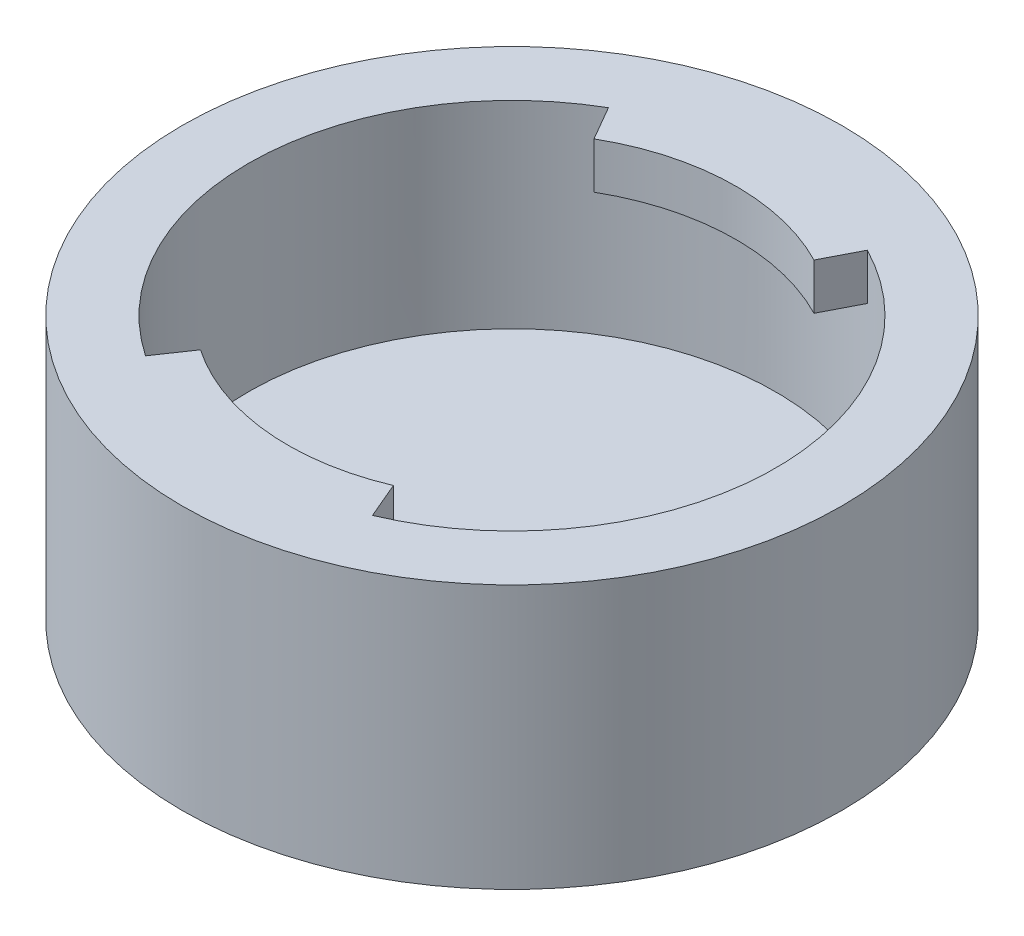
ISO-10303-21;
HEADER;
FILE_DESCRIPTION(('STEP AP214'),'2;1');
FILE_NAME('part.step','',(''),(''),'','','');
FILE_SCHEMA(('AUTOMOTIVE_DESIGN { 1 0 10303 214 1 1 1 1 }'));
ENDSEC;
DATA;
#1=APPLICATION_CONTEXT('core data for automotive mechanical design processes');
#2=APPLICATION_PROTOCOL_DEFINITION('international standard','automotive_design',2000,#1);
#3=PRODUCT_CONTEXT('',#1,'mechanical');
#4=PRODUCT('Part','Part','',(#3));
#5=PRODUCT_RELATED_PRODUCT_CATEGORY('part','',(#4));
#6=PRODUCT_DEFINITION_FORMATION('','',#4);
#7=PRODUCT_DEFINITION_CONTEXT('part definition',#1,'design');
#8=PRODUCT_DEFINITION('design','',#6,#7);
#9=PRODUCT_DEFINITION_SHAPE('','',#8);
#10=(LENGTH_UNIT() NAMED_UNIT(*) SI_UNIT(.MILLI.,.METRE.));
#11=(NAMED_UNIT(*) PLANE_ANGLE_UNIT() SI_UNIT($,.RADIAN.));
#12=(NAMED_UNIT(*) SI_UNIT($,.STERADIAN.) SOLID_ANGLE_UNIT());
#13=UNCERTAINTY_MEASURE_WITH_UNIT(LENGTH_MEASURE(1.E-05),#10,'distance_accuracy_value','');
#14=(GEOMETRIC_REPRESENTATION_CONTEXT(3) GLOBAL_UNCERTAINTY_ASSIGNED_CONTEXT((#13)) GLOBAL_UNIT_ASSIGNED_CONTEXT((#10,
#11,#12)) REPRESENTATION_CONTEXT('',''));
#15=CARTESIAN_POINT('',(0.,0.,0.));
#16=DIRECTION('',(0.,0.,1.));
#17=DIRECTION('',(1.,0.,0.));
#18=AXIS2_PLACEMENT_3D('',#15,#16,#17);
#19=CARTESIAN_POINT('',(0.,1.27,0.));
#20=DIRECTION('',(0.,-1.,0.));
#21=DIRECTION('',(0.,0.,-1.));
#22=AXIS2_PLACEMENT_3D('',#19,#20,#21);
#23=CYLINDRICAL_SURFACE('',#22,6.35);
#24=CARTESIAN_POINT('',(0.,0.,0.));
#25=DIRECTION('',(0.,1.,0.));
#26=DIRECTION('',(0.,0.,1.));
#27=AXIS2_PLACEMENT_3D('',#24,#25,#26);
#28=CIRCLE('',#27,6.35);
#29=CARTESIAN_POINT('',(0.,0.,6.35));
#30=VERTEX_POINT('',#29);
#31=EDGE_CURVE('E90',#30,#30,#28,.T.);
#32=ORIENTED_EDGE('',*,*,#31,.T.);
#33=EDGE_LOOP('',(#32));
#34=FACE_BOUND('',#33,.T.);
#35=CARTESIAN_POINT('',(0.,5.08,0.));
#36=DIRECTION('',(0.,1.,0.));
#37=DIRECTION('',(0.,0.,1.));
#38=AXIS2_PLACEMENT_3D('',#35,#36,#37);
#39=CIRCLE('',#38,6.35);
#40=CARTESIAN_POINT('',(0.,5.08,6.35));
#41=VERTEX_POINT('',#40);
#42=EDGE_CURVE('E232',#41,#41,#39,.T.);
#43=ORIENTED_EDGE('',*,*,#42,.F.);
#44=EDGE_LOOP('',(#43));
#45=FACE_BOUND('',#44,.T.);
#46=ADVANCED_FACE('F83',(#34,#45),#23,.T.);
#47=CARTESIAN_POINT('',(0.,0.,0.));
#48=DIRECTION('',(0.,1.,0.));
#49=DIRECTION('',(0.,0.,1.));
#50=AXIS2_PLACEMENT_3D('',#47,#48,#49);
#51=PLANE('',#50);
#52=ORIENTED_EDGE('',*,*,#31,.F.);
#53=EDGE_LOOP('',(#52));
#54=FACE_BOUND('',#53,.T.);
#55=ADVANCED_FACE('F239',(#54),#51,.F.);
#56=CARTESIAN_POINT('',(0.,5.08,0.));
#57=DIRECTION('',(0.,1.,0.));
#58=DIRECTION('',(0.,0.,1.));
#59=AXIS2_PLACEMENT_3D('',#56,#57,#58);
#60=PLANE('',#59);
#61=ORIENTED_EDGE('',*,*,#42,.T.);
#62=EDGE_LOOP('',(#61));
#63=FACE_BOUND('',#62,.T.);
#64=CARTESIAN_POINT('',(0.,5.08,0.));
#65=DIRECTION('',(0.,1.,0.));
#66=DIRECTION('',(0.,0.,1.));
#67=AXIS2_PLACEMENT_3D('',#64,#65,#66);
#68=CIRCLE('',#67,5.08);
#69=CARTESIAN_POINT('',(1.98775729537348,5.08,4.67495678425903));
#70=VERTEX_POINT('',#69);
#71=CARTESIAN_POINT('',(2.32841772382184,5.08,-4.51496078647338));
#72=VERTEX_POINT('',#71);
#73=EDGE_CURVE('E230',#70,#72,#68,.T.);
#74=ORIENTED_EDGE('',*,*,#73,.F.);
#75=DIRECTION('',(0.391290806175882,0.,0.920267083515557));
#76=VECTOR('',#75,1.);
#77=CARTESIAN_POINT('',(1.98775729537348,5.08,4.67495678425903));
#78=LINE('',#77,#76);
#79=CARTESIAN_POINT('',(1.68959370106745,5.08,3.97371326662018));
#80=VERTEX_POINT('',#79);
#81=EDGE_CURVE('E202',#80,#70,#78,.T.);
#82=ORIENTED_EDGE('',*,*,#81,.F.);
#83=CARTESIAN_POINT('',(0.,5.08,0.));
#84=DIRECTION('',(0.,-1.,0.));
#85=DIRECTION('',(0.,0.,-1.));
#86=AXIS2_PLACEMENT_3D('',#83,#84,#85);
#87=CIRCLE('',#86,4.318);
#88=CARTESIAN_POINT('',(-2.43087304314005,5.08,3.56875051637615));
#89=VERTEX_POINT('',#88);
#90=EDGE_CURVE('E209',#89,#80,#87,.F.);
#91=ORIENTED_EDGE('',*,*,#90,.F.);
#92=DIRECTION('',(-0.562962724210295,0.,0.826482287257097));
#93=VECTOR('',#92,1.);
#94=CARTESIAN_POINT('',(-2.8598506389883,5.08,4.19853001926606));
#95=LINE('',#94,#93);
#96=CARTESIAN_POINT('',(-2.8598506389883,5.08,4.19853001926606));
#97=VERTEX_POINT('',#96);
#98=EDGE_CURVE('E226',#89,#97,#95,.T.);
#99=ORIENTED_EDGE('',*,*,#98,.T.);
#100=CARTESIAN_POINT('',(-2.54115903415761,5.08,-4.39873967894432));
#101=VERTEX_POINT('',#100);
#102=EDGE_CURVE('E153',#101,#97,#68,.T.);
#103=ORIENTED_EDGE('',*,*,#102,.F.);
#104=DIRECTION('',(0.500228156330238,0.,0.865893637587464));
#105=VECTOR('',#104,1.);
#106=CARTESIAN_POINT('',(-2.54115903415761,5.08,-4.39873967894432));
#107=LINE('',#106,#105);
#108=CARTESIAN_POINT('',(-2.15998517903397,5.08,-3.73892872710267));
#109=VERTEX_POINT('',#108);
#110=EDGE_CURVE('E146',#101,#109,#107,.T.);
#111=ORIENTED_EDGE('',*,*,#110,.T.);
#112=CARTESIAN_POINT('',(0.,5.08,0.));
#113=DIRECTION('',(0.,-1.,0.));
#114=DIRECTION('',(0.,0.,-1.));
#115=AXIS2_PLACEMENT_3D('',#112,#113,#114);
#116=CIRCLE('',#115,4.318);
#117=CARTESIAN_POINT('',(1.97915506524856,5.08,-3.83771666850237));
#118=VERTEX_POINT('',#117);
#119=EDGE_CURVE('E151',#118,#109,#116,.F.);
#120=ORIENTED_EDGE('',*,*,#119,.F.);
#121=DIRECTION('',(-0.45834994563422,0.,0.888771808360902));
#122=VECTOR('',#121,1.);
#123=CARTESIAN_POINT('',(2.32841772382184,5.08,-4.51496078647338));
#124=LINE('',#123,#122);
#125=EDGE_CURVE('E155',#72,#118,#124,.T.);
#126=ORIENTED_EDGE('',*,*,#125,.F.);
#127=EDGE_LOOP('',(#74,#82,#91,#99,#103,#111,#120,#126));
#128=FACE_BOUND('',#127,.T.);
#129=ADVANCED_FACE('F148',(#63,#128),#60,.T.);
#130=CARTESIAN_POINT('',(0.,5.08,0.));
#131=DIRECTION('',(0.,-1.,0.));
#132=DIRECTION('',(0.,0.,-1.));
#133=AXIS2_PLACEMENT_3D('',#130,#131,#132);
#134=CYLINDRICAL_SURFACE('',#133,5.08);
#135=DIRECTION('',(0.,1.,0.));
#136=VECTOR('',#135,1.);
#137=CARTESIAN_POINT('',(2.32841772382184,4.191,-4.51496078647338));
#138=LINE('',#137,#136);
#139=CARTESIAN_POINT('',(2.32841772382184,4.191,-4.51496078647338));
#140=VERTEX_POINT('',#139);
#141=EDGE_CURVE('E166',#140,#72,#138,.T.);
#142=ORIENTED_EDGE('',*,*,#141,.F.);
#143=CARTESIAN_POINT('',(0.,4.191,0.));
#144=DIRECTION('',(0.,-1.,0.));
#145=DIRECTION('',(0.45834994563422,0.,-0.888771808360902));
#146=AXIS2_PLACEMENT_3D('',#143,#144,#145);
#147=CIRCLE('',#146,5.08);
#148=CARTESIAN_POINT('',(-2.54115903415761,4.191,-4.39873967894432));
#149=VERTEX_POINT('',#148);
#150=EDGE_CURVE('E97',#149,#140,#147,.T.);
#151=ORIENTED_EDGE('',*,*,#150,.F.);
#152=DIRECTION('',(0.,-1.,0.));
#153=VECTOR('',#152,1.);
#154=CARTESIAN_POINT('',(-2.54115903415761,5.08,-4.39873967894432));
#155=LINE('',#154,#153);
#156=EDGE_CURVE('E102',#101,#149,#155,.T.);
#157=ORIENTED_EDGE('',*,*,#156,.F.);
#158=ORIENTED_EDGE('',*,*,#102,.T.);
#159=DIRECTION('',(0.,-1.,0.));
#160=VECTOR('',#159,1.);
#161=CARTESIAN_POINT('',(-2.8598506389883,5.08,4.19853001926606));
#162=LINE('',#161,#160);
#163=CARTESIAN_POINT('',(-2.8598506389883,4.191,4.19853001926606));
#164=VERTEX_POINT('',#163);
#165=EDGE_CURVE('E194',#97,#164,#162,.T.);
#166=ORIENTED_EDGE('',*,*,#165,.T.);
#167=CARTESIAN_POINT('',(0.,4.191,0.));
#168=DIRECTION('',(0.,-1.,0.));
#169=DIRECTION('',(-0.562962724210294,0.,0.826482287257098));
#170=AXIS2_PLACEMENT_3D('',#167,#168,#169);
#171=CIRCLE('',#170,5.08);
#172=CARTESIAN_POINT('',(1.98775729537348,4.191,4.67495678425903));
#173=VERTEX_POINT('',#172);
#174=EDGE_CURVE('E197',#173,#164,#171,.T.);
#175=ORIENTED_EDGE('',*,*,#174,.F.);
#176=DIRECTION('',(0.,1.,0.));
#177=VECTOR('',#176,1.);
#178=CARTESIAN_POINT('',(1.98775729537348,4.191,4.67495678425903));
#179=LINE('',#178,#177);
#180=EDGE_CURVE('E198',#173,#70,#179,.T.);
#181=ORIENTED_EDGE('',*,*,#180,.T.);
#182=ORIENTED_EDGE('',*,*,#73,.T.);
#183=EDGE_LOOP('',(#142,#151,#157,#158,#166,#175,#181,#182));
#184=FACE_BOUND('',#183,.T.);
#185=CARTESIAN_POINT('',(0.,1.27,0.));
#186=DIRECTION('',(0.,1.,0.));
#187=DIRECTION('',(0.,0.,1.));
#188=AXIS2_PLACEMENT_3D('',#185,#186,#187);
#189=CIRCLE('',#188,5.08);
#190=CARTESIAN_POINT('',(0.,1.27,5.08));
#191=VERTEX_POINT('',#190);
#192=EDGE_CURVE('E13',#191,#191,#189,.F.);
#193=ORIENTED_EDGE('',*,*,#192,.T.);
#194=EDGE_LOOP('',(#193));
#195=FACE_BOUND('',#194,.T.);
#196=ADVANCED_FACE('F245',(#184,#195),#134,.F.);
#197=CARTESIAN_POINT('',(0.,1.27,0.));
#198=DIRECTION('',(0.,1.,0.));
#199=DIRECTION('',(0.,0.,1.));
#200=AXIS2_PLACEMENT_3D('',#197,#198,#199);
#201=PLANE('',#200);
#202=ORIENTED_EDGE('',*,*,#192,.F.);
#203=EDGE_LOOP('',(#202));
#204=FACE_BOUND('',#203,.T.);
#205=ADVANCED_FACE('F249',(#204),#201,.T.);
#206=CARTESIAN_POINT('',(-2.8598506389883,4.6355,4.19853001926606));
#207=DIRECTION('',(-0.826482287257098,0.,-0.562962724210294));
#208=DIRECTION('',(0.,-1.,0.));
#209=AXIS2_PLACEMENT_3D('',#206,#207,#208);
#210=PLANE('',#209);
#211=ORIENTED_EDGE('',*,*,#98,.F.);
#212=DIRECTION('',(0.,-1.,0.));
#213=VECTOR('',#212,1.);
#214=CARTESIAN_POINT('',(-2.43087304314005,5.08,3.56875051637615));
#215=LINE('',#214,#213);
#216=CARTESIAN_POINT('',(-2.43087304314005,4.191,3.56875051637615));
#217=VERTEX_POINT('',#216);
#218=EDGE_CURVE('E213',#89,#217,#215,.T.);
#219=ORIENTED_EDGE('',*,*,#218,.T.);
#220=DIRECTION('',(-0.562962724210294,0.,0.826482287257098));
#221=VECTOR('',#220,1.);
#222=CARTESIAN_POINT('',(-2.8598506389883,4.191,4.19853001926606));
#223=LINE('',#222,#221);
#224=EDGE_CURVE('E223',#217,#164,#223,.T.);
#225=ORIENTED_EDGE('',*,*,#224,.T.);
#226=ORIENTED_EDGE('',*,*,#165,.F.);
#227=EDGE_LOOP('',(#211,#219,#225,#226));
#228=FACE_BOUND('',#227,.T.);
#229=ADVANCED_FACE('F251',(#228),#210,.T.);
#230=CARTESIAN_POINT('',(0.,4.191,0.));
#231=DIRECTION('',(0.,1.,0.));
#232=DIRECTION('',(0.,0.,1.));
#233=AXIS2_PLACEMENT_3D('',#230,#231,#232);
#234=PLANE('',#233);
#235=ORIENTED_EDGE('',*,*,#224,.F.);
#236=CARTESIAN_POINT('',(0.,4.191,0.));
#237=DIRECTION('',(0.,-1.,0.));
#238=DIRECTION('',(0.,0.,-1.));
#239=AXIS2_PLACEMENT_3D('',#236,#237,#238);
#240=CIRCLE('',#239,4.318);
#241=CARTESIAN_POINT('',(1.68959370106745,4.191,3.97371326662018));
#242=VERTEX_POINT('',#241);
#243=EDGE_CURVE('E206',#242,#217,#240,.T.);
#244=ORIENTED_EDGE('',*,*,#243,.F.);
#245=DIRECTION('',(0.391290806175881,0.,0.920267083515557));
#246=VECTOR('',#245,1.);
#247=CARTESIAN_POINT('',(1.98775729537348,4.191,4.67495678425903));
#248=LINE('',#247,#246);
#249=EDGE_CURVE('E220',#242,#173,#248,.T.);
#250=ORIENTED_EDGE('',*,*,#249,.T.);
#251=ORIENTED_EDGE('',*,*,#174,.T.);
#252=EDGE_LOOP('',(#235,#244,#250,#251));
#253=FACE_BOUND('',#252,.T.);
#254=ADVANCED_FACE('F258',(#253),#234,.F.);
#255=CARTESIAN_POINT('',(1.98775729537348,4.6355,4.67495678425903));
#256=DIRECTION('',(0.920267083515557,0.,-0.391290806175881));
#257=DIRECTION('',(0.,1.,0.));
#258=AXIS2_PLACEMENT_3D('',#255,#256,#257);
#259=PLANE('',#258);
#260=ORIENTED_EDGE('',*,*,#249,.F.);
#261=DIRECTION('',(0.,-1.,0.));
#262=VECTOR('',#261,1.);
#263=CARTESIAN_POINT('',(1.68959370106745,5.08,3.97371326662018));
#264=LINE('',#263,#262);
#265=EDGE_CURVE('E192',#242,#80,#264,.F.);
#266=ORIENTED_EDGE('',*,*,#265,.T.);
#267=ORIENTED_EDGE('',*,*,#81,.T.);
#268=ORIENTED_EDGE('',*,*,#180,.F.);
#269=EDGE_LOOP('',(#260,#266,#267,#268));
#270=FACE_BOUND('',#269,.T.);
#271=ADVANCED_FACE('F262',(#270),#259,.T.);
#272=CARTESIAN_POINT('',(0.,5.08,0.));
#273=DIRECTION('',(0.,-1.,0.));
#274=DIRECTION('',(0.,0.,-1.));
#275=AXIS2_PLACEMENT_3D('',#272,#273,#274);
#276=CYLINDRICAL_SURFACE('',#275,4.318);
#277=ORIENTED_EDGE('',*,*,#265,.F.);
#278=ORIENTED_EDGE('',*,*,#243,.T.);
#279=ORIENTED_EDGE('',*,*,#218,.F.);
#280=ORIENTED_EDGE('',*,*,#90,.T.);
#281=EDGE_LOOP('',(#277,#278,#279,#280));
#282=FACE_BOUND('',#281,.T.);
#283=ADVANCED_FACE('F266',(#282),#276,.F.);
#284=CARTESIAN_POINT('',(2.32841772382184,4.6355,-4.51496078647338));
#285=DIRECTION('',(-0.888771808360902,0.,-0.45834994563422));
#286=DIRECTION('',(0.,1.,0.));
#287=AXIS2_PLACEMENT_3D('',#284,#285,#286);
#288=PLANE('',#287);
#289=DIRECTION('',(-0.45834994563422,0.,0.888771808360902));
#290=VECTOR('',#289,1.);
#291=CARTESIAN_POINT('',(2.32841772382184,4.191,-4.51496078647338));
#292=LINE('',#291,#290);
#293=CARTESIAN_POINT('',(1.97915506524856,4.191,-3.83771666850237));
#294=VERTEX_POINT('',#293);
#295=EDGE_CURVE('E191',#140,#294,#292,.T.);
#296=ORIENTED_EDGE('',*,*,#295,.F.);
#297=ORIENTED_EDGE('',*,*,#141,.T.);
#298=ORIENTED_EDGE('',*,*,#125,.T.);
#299=DIRECTION('',(0.,-1.,0.));
#300=VECTOR('',#299,1.);
#301=CARTESIAN_POINT('',(1.97915506524856,5.08,-3.83771666850237));
#302=LINE('',#301,#300);
#303=EDGE_CURVE('E171',#294,#118,#302,.F.);
#304=ORIENTED_EDGE('',*,*,#303,.F.);
#305=EDGE_LOOP('',(#296,#297,#298,#304));
#306=FACE_BOUND('',#305,.T.);
#307=ADVANCED_FACE('F270',(#306),#288,.F.);
#308=CARTESIAN_POINT('',(-2.54115903415761,4.6355,-4.39873967894432));
#309=DIRECTION('',(0.865893637587464,0.,-0.500228156330238));
#310=DIRECTION('',(0.,-1.,0.));
#311=AXIS2_PLACEMENT_3D('',#308,#309,#310);
#312=PLANE('',#311);
#313=ORIENTED_EDGE('',*,*,#110,.F.);
#314=ORIENTED_EDGE('',*,*,#156,.T.);
#315=DIRECTION('',(0.500228156330238,0.,0.865893637587464));
#316=VECTOR('',#315,1.);
#317=CARTESIAN_POINT('',(-2.54115903415761,4.191,-4.39873967894432));
#318=LINE('',#317,#316);
#319=CARTESIAN_POINT('',(-2.15998517903397,4.191,-3.73892872710267));
#320=VERTEX_POINT('',#319);
#321=EDGE_CURVE('E156',#149,#320,#318,.T.);
#322=ORIENTED_EDGE('',*,*,#321,.T.);
#323=DIRECTION('',(0.,-1.,0.));
#324=VECTOR('',#323,1.);
#325=CARTESIAN_POINT('',(-2.15998517903397,5.08,-3.73892872710267));
#326=LINE('',#325,#324);
#327=EDGE_CURVE('E159',#109,#320,#326,.T.);
#328=ORIENTED_EDGE('',*,*,#327,.F.);
#329=EDGE_LOOP('',(#313,#314,#322,#328));
#330=FACE_BOUND('',#329,.T.);
#331=ADVANCED_FACE('F160',(#330),#312,.F.);
#332=CARTESIAN_POINT('',(0.,4.191,0.));
#333=DIRECTION('',(0.,1.,0.));
#334=DIRECTION('',(0.,0.,1.));
#335=AXIS2_PLACEMENT_3D('',#332,#333,#334);
#336=PLANE('',#335);
#337=ORIENTED_EDGE('',*,*,#150,.T.);
#338=ORIENTED_EDGE('',*,*,#295,.T.);
#339=CARTESIAN_POINT('',(0.,4.191,0.));
#340=DIRECTION('',(0.,-1.,0.));
#341=DIRECTION('',(0.,0.,-1.));
#342=AXIS2_PLACEMENT_3D('',#339,#340,#341);
#343=CIRCLE('',#342,4.318);
#344=EDGE_CURVE('E165',#320,#294,#343,.T.);
#345=ORIENTED_EDGE('',*,*,#344,.F.);
#346=ORIENTED_EDGE('',*,*,#321,.F.);
#347=EDGE_LOOP('',(#337,#338,#345,#346));
#348=FACE_BOUND('',#347,.T.);
#349=ADVANCED_FACE('F272',(#348),#336,.F.);
#350=CARTESIAN_POINT('',(0.,5.08,0.));
#351=DIRECTION('',(0.,-1.,0.));
#352=DIRECTION('',(0.,0.,-1.));
#353=AXIS2_PLACEMENT_3D('',#350,#351,#352);
#354=CYLINDRICAL_SURFACE('',#353,4.318);
#355=ORIENTED_EDGE('',*,*,#327,.T.);
#356=ORIENTED_EDGE('',*,*,#344,.T.);
#357=ORIENTED_EDGE('',*,*,#303,.T.);
#358=ORIENTED_EDGE('',*,*,#119,.T.);
#359=EDGE_LOOP('',(#355,#356,#357,#358));
#360=FACE_BOUND('',#359,.T.);
#361=ADVANCED_FACE('F169',(#360),#354,.F.);
#362=CLOSED_SHELL('',(#46,#55,#129,#196,#205,#229,#254,#271,#283,#307,#331,#349,#361));
#363=MANIFOLD_SOLID_BREP('B2',#362);
#364=ADVANCED_BREP_SHAPE_REPRESENTATION('',(#18,#363),#14);
#365=SHAPE_DEFINITION_REPRESENTATION(#9,#364);
ENDSEC;
END-ISO-10303-21;
